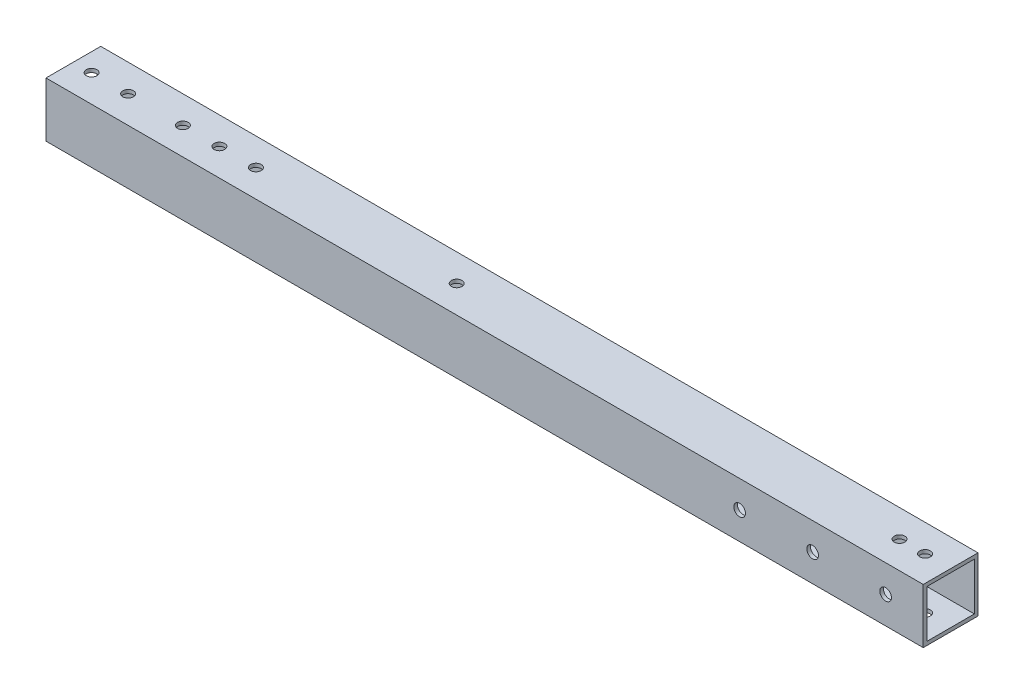
ISO-10303-21;
HEADER;
FILE_DESCRIPTION(('STEP AP214'),'2;1');
FILE_NAME('part.step','',(''),(''),'','','');
FILE_SCHEMA(('AUTOMOTIVE_DESIGN { 1 0 10303 214 1 1 1 1 }'));
ENDSEC;
DATA;
#1=APPLICATION_CONTEXT('core data for automotive mechanical design processes');
#2=APPLICATION_PROTOCOL_DEFINITION('international standard','automotive_design',2000,#1);
#3=PRODUCT_CONTEXT('',#1,'mechanical');
#4=PRODUCT('Part','Part','',(#3));
#5=PRODUCT_RELATED_PRODUCT_CATEGORY('part','',(#4));
#6=PRODUCT_DEFINITION_FORMATION('','',#4);
#7=PRODUCT_DEFINITION_CONTEXT('part definition',#1,'design');
#8=PRODUCT_DEFINITION('design','',#6,#7);
#9=PRODUCT_DEFINITION_SHAPE('','',#8);
#10=(LENGTH_UNIT() NAMED_UNIT(*) SI_UNIT(.MILLI.,.METRE.));
#11=(NAMED_UNIT(*) PLANE_ANGLE_UNIT() SI_UNIT($,.RADIAN.));
#12=(NAMED_UNIT(*) SI_UNIT($,.STERADIAN.) SOLID_ANGLE_UNIT());
#13=UNCERTAINTY_MEASURE_WITH_UNIT(LENGTH_MEASURE(1.E-05),#10,'distance_accuracy_value','');
#14=(GEOMETRIC_REPRESENTATION_CONTEXT(3) GLOBAL_UNCERTAINTY_ASSIGNED_CONTEXT((#13)) GLOBAL_UNIT_ASSIGNED_CONTEXT((#10,
#11,#12)) REPRESENTATION_CONTEXT('',''));
#15=CARTESIAN_POINT('',(0.,0.,0.));
#16=DIRECTION('',(0.,0.,1.));
#17=DIRECTION('',(1.,0.,0.));
#18=AXIS2_PLACEMENT_3D('',#15,#16,#17);
#19=CARTESIAN_POINT('',(240.3,0.,0.));
#20=DIRECTION('',(-1.,0.,0.));
#21=DIRECTION('',(0.,0.,1.));
#22=AXIS2_PLACEMENT_3D('',#19,#20,#21);
#23=PLANE('',#22);
#24=DIRECTION('',(0.,1.,0.));
#25=VECTOR('',#24,1.);
#26=CARTESIAN_POINT('',(240.3,-7.5,-7.5));
#27=LINE('',#26,#25);
#28=CARTESIAN_POINT('',(240.3,-7.5,-7.5));
#29=VERTEX_POINT('',#28);
#30=CARTESIAN_POINT('',(240.3,7.5,-7.5));
#31=VERTEX_POINT('',#30);
#32=EDGE_CURVE('E164',#29,#31,#27,.T.);
#33=ORIENTED_EDGE('',*,*,#32,.T.);
#34=DIRECTION('',(0.,0.,1.));
#35=VECTOR('',#34,1.);
#36=CARTESIAN_POINT('',(240.3,7.5,7.5));
#37=LINE('',#36,#35);
#38=CARTESIAN_POINT('',(240.3,7.5,7.5));
#39=VERTEX_POINT('',#38);
#40=EDGE_CURVE('E168',#31,#39,#37,.T.);
#41=ORIENTED_EDGE('',*,*,#40,.T.);
#42=DIRECTION('',(0.,-1.,0.));
#43=VECTOR('',#42,1.);
#44=CARTESIAN_POINT('',(240.3,-7.5,7.5));
#45=LINE('',#44,#43);
#46=CARTESIAN_POINT('',(240.3,-7.5,7.5));
#47=VERTEX_POINT('',#46);
#48=EDGE_CURVE('E172',#39,#47,#45,.T.);
#49=ORIENTED_EDGE('',*,*,#48,.T.);
#50=DIRECTION('',(0.,0.,-1.));
#51=VECTOR('',#50,1.);
#52=CARTESIAN_POINT('',(240.3,-7.5,7.5));
#53=LINE('',#52,#51);
#54=EDGE_CURVE('E175',#47,#29,#53,.T.);
#55=ORIENTED_EDGE('',*,*,#54,.T.);
#56=EDGE_LOOP('',(#33,#41,#49,#55));
#57=FACE_BOUND('',#56,.T.);
#58=DIRECTION('',(0.,0.,-1.));
#59=VECTOR('',#58,1.);
#60=CARTESIAN_POINT('',(240.3,-6.5,6.5));
#61=LINE('',#60,#59);
#62=CARTESIAN_POINT('',(240.3,-6.5,6.5));
#63=VERTEX_POINT('',#62);
#64=CARTESIAN_POINT('',(240.3,-6.5,-6.5));
#65=VERTEX_POINT('',#64);
#66=EDGE_CURVE('E112',#63,#65,#61,.T.);
#67=ORIENTED_EDGE('',*,*,#66,.F.);
#68=DIRECTION('',(0.,-1.,0.));
#69=VECTOR('',#68,1.);
#70=CARTESIAN_POINT('',(240.3,-6.5,6.5));
#71=LINE('',#70,#69);
#72=CARTESIAN_POINT('',(240.3,6.5,6.5));
#73=VERTEX_POINT('',#72);
#74=EDGE_CURVE('E140',#73,#63,#71,.T.);
#75=ORIENTED_EDGE('',*,*,#74,.F.);
#76=DIRECTION('',(0.,0.,1.));
#77=VECTOR('',#76,1.);
#78=CARTESIAN_POINT('',(240.3,6.5,6.5));
#79=LINE('',#78,#77);
#80=CARTESIAN_POINT('',(240.3,6.5,-6.5));
#81=VERTEX_POINT('',#80);
#82=EDGE_CURVE('E134',#81,#73,#79,.T.);
#83=ORIENTED_EDGE('',*,*,#82,.F.);
#84=DIRECTION('',(0.,1.,0.));
#85=VECTOR('',#84,1.);
#86=CARTESIAN_POINT('',(240.3,-6.5,-6.5));
#87=LINE('',#86,#85);
#88=EDGE_CURVE('E121',#65,#81,#87,.T.);
#89=ORIENTED_EDGE('',*,*,#88,.F.);
#90=EDGE_LOOP('',(#67,#75,#83,#89));
#91=FACE_BOUND('',#90,.T.);
#92=ADVANCED_FACE('F44',(#57,#91),#23,.F.);
#93=CARTESIAN_POINT('',(0.,0.,0.));
#94=DIRECTION('',(-1.,0.,0.));
#95=DIRECTION('',(0.,0.,1.));
#96=AXIS2_PLACEMENT_3D('',#93,#94,#95);
#97=PLANE('',#96);
#98=DIRECTION('',(0.,1.,0.));
#99=VECTOR('',#98,1.);
#100=CARTESIAN_POINT('',(0.,-7.5,-7.5));
#101=LINE('',#100,#99);
#102=CARTESIAN_POINT('',(0.,-7.5,-7.5));
#103=VERTEX_POINT('',#102);
#104=CARTESIAN_POINT('',(0.,7.5,-7.5));
#105=VERTEX_POINT('',#104);
#106=EDGE_CURVE('E130',#103,#105,#101,.T.);
#107=ORIENTED_EDGE('',*,*,#106,.F.);
#108=DIRECTION('',(0.,0.,-1.));
#109=VECTOR('',#108,1.);
#110=CARTESIAN_POINT('',(0.,-7.5,7.5));
#111=LINE('',#110,#109);
#112=CARTESIAN_POINT('',(0.,-7.5,7.5));
#113=VERTEX_POINT('',#112);
#114=EDGE_CURVE('E169',#113,#103,#111,.T.);
#115=ORIENTED_EDGE('',*,*,#114,.F.);
#116=DIRECTION('',(0.,-1.,0.));
#117=VECTOR('',#116,1.);
#118=CARTESIAN_POINT('',(0.,-7.5,7.5));
#119=LINE('',#118,#117);
#120=CARTESIAN_POINT('',(0.,7.5,7.5));
#121=VERTEX_POINT('',#120);
#122=EDGE_CURVE('E185',#121,#113,#119,.T.);
#123=ORIENTED_EDGE('',*,*,#122,.F.);
#124=DIRECTION('',(0.,0.,1.));
#125=VECTOR('',#124,1.);
#126=CARTESIAN_POINT('',(0.,7.5,7.5));
#127=LINE('',#126,#125);
#128=EDGE_CURVE('E182',#105,#121,#127,.T.);
#129=ORIENTED_EDGE('',*,*,#128,.F.);
#130=EDGE_LOOP('',(#107,#115,#123,#129));
#131=FACE_BOUND('',#130,.T.);
#132=DIRECTION('',(0.,-1.,0.));
#133=VECTOR('',#132,1.);
#134=CARTESIAN_POINT('',(0.,-6.5,6.5));
#135=LINE('',#134,#133);
#136=CARTESIAN_POINT('',(0.,6.5,6.5));
#137=VERTEX_POINT('',#136);
#138=CARTESIAN_POINT('',(0.,-6.5,6.5));
#139=VERTEX_POINT('',#138);
#140=EDGE_CURVE('E122',#137,#139,#135,.T.);
#141=ORIENTED_EDGE('',*,*,#140,.T.);
#142=DIRECTION('',(0.,0.,-1.));
#143=VECTOR('',#142,1.);
#144=CARTESIAN_POINT('',(0.,-6.5,6.5));
#145=LINE('',#144,#143);
#146=CARTESIAN_POINT('',(0.,-6.5,-6.5));
#147=VERTEX_POINT('',#146);
#148=EDGE_CURVE('E70',#139,#147,#145,.T.);
#149=ORIENTED_EDGE('',*,*,#148,.T.);
#150=DIRECTION('',(0.,1.,0.));
#151=VECTOR('',#150,1.);
#152=CARTESIAN_POINT('',(0.,-6.5,-6.5));
#153=LINE('',#152,#151);
#154=CARTESIAN_POINT('',(0.,6.5,-6.5));
#155=VERTEX_POINT('',#154);
#156=EDGE_CURVE('E128',#147,#155,#153,.T.);
#157=ORIENTED_EDGE('',*,*,#156,.T.);
#158=DIRECTION('',(0.,0.,1.));
#159=VECTOR('',#158,1.);
#160=CARTESIAN_POINT('',(0.,6.5,6.5));
#161=LINE('',#160,#159);
#162=EDGE_CURVE('E151',#155,#137,#161,.T.);
#163=ORIENTED_EDGE('',*,*,#162,.T.);
#164=EDGE_LOOP('',(#141,#149,#157,#163));
#165=FACE_BOUND('',#164,.T.);
#166=ADVANCED_FACE('F398',(#131,#165),#97,.T.);
#167=CARTESIAN_POINT('',(240.3,-7.5,-7.5));
#168=DIRECTION('',(0.,0.,1.));
#169=DIRECTION('',(1.,0.,0.));
#170=AXIS2_PLACEMENT_3D('',#167,#168,#169);
#171=PLANE('',#170);
#172=CARTESIAN_POINT('',(229.998484809867,2.61686872083814E-13,-7.5));
#173=DIRECTION('',(0.,0.,1.));
#174=DIRECTION('',(1.,0.,0.));
#175=AXIS2_PLACEMENT_3D('',#172,#173,#174);
#176=CIRCLE('',#175,1.59999999999999);
#177=CARTESIAN_POINT('',(231.598484809867,2.61686872083814E-13,-7.5));
#178=VERTEX_POINT('',#177);
#179=EDGE_CURVE('E242',#178,#178,#176,.T.);
#180=ORIENTED_EDGE('',*,*,#179,.T.);
#181=EDGE_LOOP('',(#180));
#182=FACE_BOUND('',#181,.T.);
#183=CARTESIAN_POINT('',(189.998484809867,2.78340217453191E-13,-7.5));
#184=DIRECTION('',(0.,0.,1.));
#185=DIRECTION('',(1.,0.,0.));
#186=AXIS2_PLACEMENT_3D('',#183,#184,#185);
#187=CIRCLE('',#186,1.59999999999999);
#188=CARTESIAN_POINT('',(191.598484809867,2.78340217453191E-13,-7.5));
#189=VERTEX_POINT('',#188);
#190=EDGE_CURVE('E502',#189,#189,#187,.T.);
#191=ORIENTED_EDGE('',*,*,#190,.T.);
#192=EDGE_LOOP('',(#191));
#193=FACE_BOUND('',#192,.T.);
#194=CARTESIAN_POINT('',(209.998484809867,2.71748268244479E-13,-7.5));
#195=DIRECTION('',(0.,0.,1.));
#196=DIRECTION('',(1.,0.,0.));
#197=AXIS2_PLACEMENT_3D('',#194,#195,#196);
#198=CIRCLE('',#197,1.59999999999999);
#199=CARTESIAN_POINT('',(211.598484809867,2.71748268244479E-13,-7.5));
#200=VERTEX_POINT('',#199);
#201=EDGE_CURVE('E261',#200,#200,#198,.T.);
#202=ORIENTED_EDGE('',*,*,#201,.T.);
#203=EDGE_LOOP('',(#202));
#204=FACE_BOUND('',#203,.T.);
#205=ORIENTED_EDGE('',*,*,#106,.T.);
#206=DIRECTION('',(-1.,0.,0.));
#207=VECTOR('',#206,1.);
#208=CARTESIAN_POINT('',(240.3,7.5,-7.5));
#209=LINE('',#208,#207);
#210=EDGE_CURVE('E11',#31,#105,#209,.T.);
#211=ORIENTED_EDGE('',*,*,#210,.F.);
#212=ORIENTED_EDGE('',*,*,#32,.F.);
#213=DIRECTION('',(-1.,0.,0.));
#214=VECTOR('',#213,1.);
#215=CARTESIAN_POINT('',(240.3,-7.5,-7.5));
#216=LINE('',#215,#214);
#217=EDGE_CURVE('E178',#29,#103,#216,.T.);
#218=ORIENTED_EDGE('',*,*,#217,.T.);
#219=EDGE_LOOP('',(#205,#211,#212,#218));
#220=FACE_BOUND('',#219,.T.);
#221=ADVANCED_FACE('F46',(#182,#193,#204,#220),#171,.F.);
#222=CARTESIAN_POINT('',(240.3,7.5,7.5));
#223=DIRECTION('',(0.,-1.,0.));
#224=DIRECTION('',(0.,0.,-1.));
#225=AXIS2_PLACEMENT_3D('',#222,#223,#224);
#226=PLANE('',#225);
#227=CARTESIAN_POINT('',(233.3,7.5,0.));
#228=DIRECTION('',(0.,1.,0.));
#229=DIRECTION('',(0.,0.,1.));
#230=AXIS2_PLACEMENT_3D('',#227,#228,#229);
#231=CIRCLE('',#230,1.45);
#232=CARTESIAN_POINT('',(233.3,7.5,1.45));
#233=VERTEX_POINT('',#232);
#234=EDGE_CURVE('E272',#233,#233,#231,.T.);
#235=ORIENTED_EDGE('',*,*,#234,.F.);
#236=EDGE_LOOP('',(#235));
#237=FACE_BOUND('',#236,.T.);
#238=CARTESIAN_POINT('',(104.998484809868,7.5,0.));
#239=DIRECTION('',(0.,1.,0.));
#240=DIRECTION('',(0.,0.,1.));
#241=AXIS2_PLACEMENT_3D('',#238,#239,#240);
#242=CIRCLE('',#241,1.45);
#243=CARTESIAN_POINT('',(104.998484809868,7.5,1.45));
#244=VERTEX_POINT('',#243);
#245=EDGE_CURVE('E294',#244,#244,#242,.T.);
#246=ORIENTED_EDGE('',*,*,#245,.F.);
#247=EDGE_LOOP('',(#246));
#248=FACE_BOUND('',#247,.T.);
#249=CARTESIAN_POINT('',(49.9984848098679,7.5,0.));
#250=DIRECTION('',(0.,1.,0.));
#251=DIRECTION('',(0.,0.,1.));
#252=AXIS2_PLACEMENT_3D('',#249,#250,#251);
#253=CIRCLE('',#252,1.45);
#254=CARTESIAN_POINT('',(49.9984848098679,7.5,1.45));
#255=VERTEX_POINT('',#254);
#256=EDGE_CURVE('E286',#255,#255,#253,.T.);
#257=ORIENTED_EDGE('',*,*,#256,.F.);
#258=EDGE_LOOP('',(#257));
#259=FACE_BOUND('',#258,.T.);
#260=CARTESIAN_POINT('',(39.9984848098679,7.5,0.));
#261=DIRECTION('',(0.,1.,0.));
#262=DIRECTION('',(0.,0.,1.));
#263=AXIS2_PLACEMENT_3D('',#260,#261,#262);
#264=CIRCLE('',#263,1.45);
#265=CARTESIAN_POINT('',(39.9984848098679,7.5,1.45));
#266=VERTEX_POINT('',#265);
#267=EDGE_CURVE('E277',#266,#266,#264,.T.);
#268=ORIENTED_EDGE('',*,*,#267,.F.);
#269=EDGE_LOOP('',(#268));
#270=FACE_BOUND('',#269,.T.);
#271=CARTESIAN_POINT('',(226.3,7.5,0.));
#272=DIRECTION('',(0.,1.,0.));
#273=DIRECTION('',(0.,0.,1.));
#274=AXIS2_PLACEMENT_3D('',#271,#272,#273);
#275=CIRCLE('',#274,1.45);
#276=CARTESIAN_POINT('',(226.3,7.5,1.45));
#277=VERTEX_POINT('',#276);
#278=EDGE_CURVE('E276',#277,#277,#275,.T.);
#279=ORIENTED_EDGE('',*,*,#278,.F.);
#280=EDGE_LOOP('',(#279));
#281=FACE_BOUND('',#280,.T.);
#282=CARTESIAN_POINT('',(14.9984848098679,7.5,3.02162921075933E-13));
#283=DIRECTION('',(0.,1.,0.));
#284=DIRECTION('',(0.,0.,1.));
#285=AXIS2_PLACEMENT_3D('',#282,#283,#284);
#286=CIRCLE('',#285,1.45);
#287=CARTESIAN_POINT('',(14.9984848098679,7.5,1.4500000000003));
#288=VERTEX_POINT('',#287);
#289=EDGE_CURVE('E322',#288,#288,#286,.T.);
#290=ORIENTED_EDGE('',*,*,#289,.F.);
#291=EDGE_LOOP('',(#290));
#292=FACE_BOUND('',#291,.T.);
#293=CARTESIAN_POINT('',(4.99848480986785,7.5,2.98811103362712E-13));
#294=DIRECTION('',(0.,1.,0.));
#295=DIRECTION('',(0.,0.,1.));
#296=AXIS2_PLACEMENT_3D('',#293,#294,#295);
#297=CIRCLE('',#296,1.45);
#298=CARTESIAN_POINT('',(4.99848480986785,7.5,1.4500000000003));
#299=VERTEX_POINT('',#298);
#300=EDGE_CURVE('E300',#299,#299,#297,.T.);
#301=ORIENTED_EDGE('',*,*,#300,.F.);
#302=EDGE_LOOP('',(#301));
#303=FACE_BOUND('',#302,.T.);
#304=CARTESIAN_POINT('',(29.9984848098679,7.5,0.));
#305=DIRECTION('',(0.,1.,0.));
#306=DIRECTION('',(0.,0.,1.));
#307=AXIS2_PLACEMENT_3D('',#304,#305,#306);
#308=CIRCLE('',#307,1.45);
#309=CARTESIAN_POINT('',(29.9984848098679,7.5,1.45));
#310=VERTEX_POINT('',#309);
#311=EDGE_CURVE('E309',#310,#310,#308,.T.);
#312=ORIENTED_EDGE('',*,*,#311,.F.);
#313=EDGE_LOOP('',(#312));
#314=FACE_BOUND('',#313,.T.);
#315=ORIENTED_EDGE('',*,*,#128,.T.);
#316=DIRECTION('',(-1.,0.,0.));
#317=VECTOR('',#316,1.);
#318=CARTESIAN_POINT('',(240.3,7.5,7.5));
#319=LINE('',#318,#317);
#320=EDGE_CURVE('E54',#39,#121,#319,.T.);
#321=ORIENTED_EDGE('',*,*,#320,.F.);
#322=ORIENTED_EDGE('',*,*,#40,.F.);
#323=ORIENTED_EDGE('',*,*,#210,.T.);
#324=EDGE_LOOP('',(#315,#321,#322,#323));
#325=FACE_BOUND('',#324,.T.);
#326=ADVANCED_FACE('F402',(#237,#248,#259,#270,#281,#292,#303,#314,#325),#226,.F.);
#327=CARTESIAN_POINT('',(240.3,-7.5,7.5));
#328=DIRECTION('',(0.,0.,-1.));
#329=DIRECTION('',(-1.,0.,0.));
#330=AXIS2_PLACEMENT_3D('',#327,#328,#329);
#331=PLANE('',#330);
#332=CARTESIAN_POINT('',(229.998484809867,2.61686872083814E-13,7.5));
#333=DIRECTION('',(0.,0.,1.));
#334=DIRECTION('',(1.,0.,0.));
#335=AXIS2_PLACEMENT_3D('',#332,#333,#334);
#336=CIRCLE('',#335,1.59999999999999);
#337=CARTESIAN_POINT('',(231.598484809867,2.61686872083814E-13,7.5));
#338=VERTEX_POINT('',#337);
#339=EDGE_CURVE('E493',#338,#338,#336,.T.);
#340=ORIENTED_EDGE('',*,*,#339,.F.);
#341=EDGE_LOOP('',(#340));
#342=FACE_BOUND('',#341,.T.);
#343=CARTESIAN_POINT('',(189.998484809867,2.78340217453191E-13,7.5));
#344=DIRECTION('',(0.,0.,1.));
#345=DIRECTION('',(1.,0.,0.));
#346=AXIS2_PLACEMENT_3D('',#343,#344,#345);
#347=CIRCLE('',#346,1.59999999999999);
#348=CARTESIAN_POINT('',(191.598484809867,2.78340217453191E-13,7.5));
#349=VERTEX_POINT('',#348);
#350=EDGE_CURVE('E497',#349,#349,#347,.T.);
#351=ORIENTED_EDGE('',*,*,#350,.F.);
#352=EDGE_LOOP('',(#351));
#353=FACE_BOUND('',#352,.T.);
#354=CARTESIAN_POINT('',(209.998484809867,2.71748268244479E-13,7.5));
#355=DIRECTION('',(0.,0.,1.));
#356=DIRECTION('',(1.,0.,0.));
#357=AXIS2_PLACEMENT_3D('',#354,#355,#356);
#358=CIRCLE('',#357,1.59999999999999);
#359=CARTESIAN_POINT('',(211.598484809867,2.71748268244479E-13,7.5));
#360=VERTEX_POINT('',#359);
#361=EDGE_CURVE('E505',#360,#360,#358,.T.);
#362=ORIENTED_EDGE('',*,*,#361,.F.);
#363=EDGE_LOOP('',(#362));
#364=FACE_BOUND('',#363,.T.);
#365=ORIENTED_EDGE('',*,*,#122,.T.);
#366=DIRECTION('',(-1.,0.,0.));
#367=VECTOR('',#366,1.);
#368=CARTESIAN_POINT('',(240.3,-7.5,7.5));
#369=LINE('',#368,#367);
#370=EDGE_CURVE('E192',#47,#113,#369,.T.);
#371=ORIENTED_EDGE('',*,*,#370,.F.);
#372=ORIENTED_EDGE('',*,*,#48,.F.);
#373=ORIENTED_EDGE('',*,*,#320,.T.);
#374=EDGE_LOOP('',(#365,#371,#372,#373));
#375=FACE_BOUND('',#374,.T.);
#376=ADVANCED_FACE('F385',(#342,#353,#364,#375),#331,.F.);
#377=CARTESIAN_POINT('',(240.3,-7.5,7.5));
#378=DIRECTION('',(0.,1.,0.));
#379=DIRECTION('',(0.,0.,1.));
#380=AXIS2_PLACEMENT_3D('',#377,#378,#379);
#381=PLANE('',#380);
#382=CARTESIAN_POINT('',(233.3,-7.5,0.));
#383=DIRECTION('',(0.,1.,0.));
#384=DIRECTION('',(0.,0.,1.));
#385=AXIS2_PLACEMENT_3D('',#382,#383,#384);
#386=CIRCLE('',#385,1.45);
#387=CARTESIAN_POINT('',(233.3,-7.5,1.45));
#388=VERTEX_POINT('',#387);
#389=EDGE_CURVE('E204',#388,#388,#386,.T.);
#390=ORIENTED_EDGE('',*,*,#389,.T.);
#391=EDGE_LOOP('',(#390));
#392=FACE_BOUND('',#391,.T.);
#393=CARTESIAN_POINT('',(104.998484809868,-7.5,0.));
#394=DIRECTION('',(0.,1.,0.));
#395=DIRECTION('',(0.,0.,1.));
#396=AXIS2_PLACEMENT_3D('',#393,#394,#395);
#397=CIRCLE('',#396,1.45);
#398=CARTESIAN_POINT('',(104.998484809868,-7.5,1.45));
#399=VERTEX_POINT('',#398);
#400=EDGE_CURVE('E268',#399,#399,#397,.T.);
#401=ORIENTED_EDGE('',*,*,#400,.T.);
#402=EDGE_LOOP('',(#401));
#403=FACE_BOUND('',#402,.T.);
#404=CARTESIAN_POINT('',(49.9984848098679,-7.5,0.));
#405=DIRECTION('',(0.,1.,0.));
#406=DIRECTION('',(0.,0.,1.));
#407=AXIS2_PLACEMENT_3D('',#404,#405,#406);
#408=CIRCLE('',#407,1.45);
#409=CARTESIAN_POINT('',(49.9984848098679,-7.5,1.45));
#410=VERTEX_POINT('',#409);
#411=EDGE_CURVE('E290',#410,#410,#408,.T.);
#412=ORIENTED_EDGE('',*,*,#411,.T.);
#413=EDGE_LOOP('',(#412));
#414=FACE_BOUND('',#413,.T.);
#415=CARTESIAN_POINT('',(39.9984848098679,-7.5,0.));
#416=DIRECTION('',(0.,1.,0.));
#417=DIRECTION('',(0.,0.,1.));
#418=AXIS2_PLACEMENT_3D('',#415,#416,#417);
#419=CIRCLE('',#418,1.45);
#420=CARTESIAN_POINT('',(39.9984848098679,-7.5,1.45));
#421=VERTEX_POINT('',#420);
#422=EDGE_CURVE('E282',#421,#421,#419,.T.);
#423=ORIENTED_EDGE('',*,*,#422,.T.);
#424=EDGE_LOOP('',(#423));
#425=FACE_BOUND('',#424,.T.);
#426=CARTESIAN_POINT('',(226.3,-7.5,0.));
#427=DIRECTION('',(0.,1.,0.));
#428=DIRECTION('',(0.,0.,1.));
#429=AXIS2_PLACEMENT_3D('',#426,#427,#428);
#430=CIRCLE('',#429,1.45);
#431=CARTESIAN_POINT('',(226.3,-7.5,1.45));
#432=VERTEX_POINT('',#431);
#433=EDGE_CURVE('E318',#432,#432,#430,.T.);
#434=ORIENTED_EDGE('',*,*,#433,.T.);
#435=EDGE_LOOP('',(#434));
#436=FACE_BOUND('',#435,.T.);
#437=CARTESIAN_POINT('',(14.9984848098679,-7.5,3.02162921075933E-13));
#438=DIRECTION('',(0.,1.,0.));
#439=DIRECTION('',(0.,0.,1.));
#440=AXIS2_PLACEMENT_3D('',#437,#438,#439);
#441=CIRCLE('',#440,1.45);
#442=CARTESIAN_POINT('',(14.9984848098679,-7.5,1.4500000000003));
#443=VERTEX_POINT('',#442);
#444=EDGE_CURVE('E304',#443,#443,#441,.T.);
#445=ORIENTED_EDGE('',*,*,#444,.T.);
#446=EDGE_LOOP('',(#445));
#447=FACE_BOUND('',#446,.T.);
#448=CARTESIAN_POINT('',(4.99848480986785,-7.5,2.98811103362712E-13));
#449=DIRECTION('',(0.,1.,0.));
#450=DIRECTION('',(0.,0.,1.));
#451=AXIS2_PLACEMENT_3D('',#448,#449,#450);
#452=CIRCLE('',#451,1.45);
#453=CARTESIAN_POINT('',(4.99848480986785,-7.5,1.4500000000003));
#454=VERTEX_POINT('',#453);
#455=EDGE_CURVE('E305',#454,#454,#452,.T.);
#456=ORIENTED_EDGE('',*,*,#455,.T.);
#457=EDGE_LOOP('',(#456));
#458=FACE_BOUND('',#457,.T.);
#459=CARTESIAN_POINT('',(29.9984848098679,-7.5,0.));
#460=DIRECTION('',(0.,1.,0.));
#461=DIRECTION('',(0.,0.,1.));
#462=AXIS2_PLACEMENT_3D('',#459,#460,#461);
#463=CIRCLE('',#462,1.45);
#464=CARTESIAN_POINT('',(29.9984848098679,-7.5,1.45));
#465=VERTEX_POINT('',#464);
#466=EDGE_CURVE('E281',#465,#465,#463,.T.);
#467=ORIENTED_EDGE('',*,*,#466,.T.);
#468=EDGE_LOOP('',(#467));
#469=FACE_BOUND('',#468,.T.);
#470=ORIENTED_EDGE('',*,*,#114,.T.);
#471=ORIENTED_EDGE('',*,*,#217,.F.);
#472=ORIENTED_EDGE('',*,*,#54,.F.);
#473=ORIENTED_EDGE('',*,*,#370,.T.);
#474=EDGE_LOOP('',(#470,#471,#472,#473));
#475=FACE_BOUND('',#474,.T.);
#476=ADVANCED_FACE('F358',(#392,#403,#414,#425,#436,#447,#458,#469,#475),#381,.F.);
#477=CARTESIAN_POINT('',(240.3,-6.5,6.5));
#478=DIRECTION('',(0.,1.,0.));
#479=DIRECTION('',(0.,0.,1.));
#480=AXIS2_PLACEMENT_3D('',#477,#478,#479);
#481=PLANE('',#480);
#482=CARTESIAN_POINT('',(233.3,-6.5,0.));
#483=DIRECTION('',(0.,1.,0.));
#484=DIRECTION('',(0.,0.,1.));
#485=AXIS2_PLACEMENT_3D('',#482,#483,#484);
#486=CIRCLE('',#485,1.45);
#487=CARTESIAN_POINT('',(233.3,-6.5,1.45));
#488=VERTEX_POINT('',#487);
#489=EDGE_CURVE('E148',#488,#488,#486,.T.);
#490=ORIENTED_EDGE('',*,*,#489,.F.);
#491=EDGE_LOOP('',(#490));
#492=FACE_BOUND('',#491,.T.);
#493=CARTESIAN_POINT('',(104.998484809868,-6.5,0.));
#494=DIRECTION('',(0.,1.,0.));
#495=DIRECTION('',(0.,0.,1.));
#496=AXIS2_PLACEMENT_3D('',#493,#494,#495);
#497=CIRCLE('',#496,1.45);
#498=CARTESIAN_POINT('',(104.998484809868,-6.5,1.45));
#499=VERTEX_POINT('',#498);
#500=EDGE_CURVE('E234',#499,#499,#497,.T.);
#501=ORIENTED_EDGE('',*,*,#500,.F.);
#502=EDGE_LOOP('',(#501));
#503=FACE_BOUND('',#502,.T.);
#504=CARTESIAN_POINT('',(49.9984848098679,-6.5,0.));
#505=DIRECTION('',(0.,1.,0.));
#506=DIRECTION('',(0.,0.,1.));
#507=AXIS2_PLACEMENT_3D('',#504,#505,#506);
#508=CIRCLE('',#507,1.45);
#509=CARTESIAN_POINT('',(49.9984848098679,-6.5,1.45));
#510=VERTEX_POINT('',#509);
#511=EDGE_CURVE('E229',#510,#510,#508,.T.);
#512=ORIENTED_EDGE('',*,*,#511,.F.);
#513=EDGE_LOOP('',(#512));
#514=FACE_BOUND('',#513,.T.);
#515=CARTESIAN_POINT('',(39.9984848098679,-6.5,0.));
#516=DIRECTION('',(0.,1.,0.));
#517=DIRECTION('',(0.,0.,1.));
#518=AXIS2_PLACEMENT_3D('',#515,#516,#517);
#519=CIRCLE('',#518,1.45);
#520=CARTESIAN_POINT('',(39.9984848098679,-6.5,1.45));
#521=VERTEX_POINT('',#520);
#522=EDGE_CURVE('E224',#521,#521,#519,.T.);
#523=ORIENTED_EDGE('',*,*,#522,.F.);
#524=EDGE_LOOP('',(#523));
#525=FACE_BOUND('',#524,.T.);
#526=CARTESIAN_POINT('',(226.3,-6.5,0.));
#527=DIRECTION('',(0.,1.,0.));
#528=DIRECTION('',(0.,0.,1.));
#529=AXIS2_PLACEMENT_3D('',#526,#527,#528);
#530=CIRCLE('',#529,1.45);
#531=CARTESIAN_POINT('',(226.3,-6.5,1.45));
#532=VERTEX_POINT('',#531);
#533=EDGE_CURVE('E219',#532,#532,#530,.T.);
#534=ORIENTED_EDGE('',*,*,#533,.F.);
#535=EDGE_LOOP('',(#534));
#536=FACE_BOUND('',#535,.T.);
#537=CARTESIAN_POINT('',(14.9984848098679,-6.5,3.02162921075933E-13));
#538=DIRECTION('',(0.,1.,0.));
#539=DIRECTION('',(0.,0.,1.));
#540=AXIS2_PLACEMENT_3D('',#537,#538,#539);
#541=CIRCLE('',#540,1.45);
#542=CARTESIAN_POINT('',(14.9984848098679,-6.5,1.4500000000003));
#543=VERTEX_POINT('',#542);
#544=EDGE_CURVE('E214',#543,#543,#541,.T.);
#545=ORIENTED_EDGE('',*,*,#544,.F.);
#546=EDGE_LOOP('',(#545));
#547=FACE_BOUND('',#546,.T.);
#548=CARTESIAN_POINT('',(4.99848480986785,-6.5,2.98811103362712E-13));
#549=DIRECTION('',(0.,1.,0.));
#550=DIRECTION('',(0.,0.,1.));
#551=AXIS2_PLACEMENT_3D('',#548,#549,#550);
#552=CIRCLE('',#551,1.45);
#553=CARTESIAN_POINT('',(4.99848480986785,-6.5,1.4500000000003));
#554=VERTEX_POINT('',#553);
#555=EDGE_CURVE('E209',#554,#554,#552,.T.);
#556=ORIENTED_EDGE('',*,*,#555,.F.);
#557=EDGE_LOOP('',(#556));
#558=FACE_BOUND('',#557,.T.);
#559=CARTESIAN_POINT('',(29.9984848098679,-6.5,0.));
#560=DIRECTION('',(0.,1.,0.));
#561=DIRECTION('',(0.,0.,1.));
#562=AXIS2_PLACEMENT_3D('',#559,#560,#561);
#563=CIRCLE('',#562,1.45);
#564=CARTESIAN_POINT('',(29.9984848098679,-6.5,1.45));
#565=VERTEX_POINT('',#564);
#566=EDGE_CURVE('E203',#565,#565,#563,.T.);
#567=ORIENTED_EDGE('',*,*,#566,.F.);
#568=EDGE_LOOP('',(#567));
#569=FACE_BOUND('',#568,.T.);
#570=ORIENTED_EDGE('',*,*,#148,.F.);
#571=DIRECTION('',(-1.,0.,0.));
#572=VECTOR('',#571,1.);
#573=CARTESIAN_POINT('',(240.3,-6.5,6.5));
#574=LINE('',#573,#572);
#575=EDGE_CURVE('E116',#63,#139,#574,.T.);
#576=ORIENTED_EDGE('',*,*,#575,.F.);
#577=ORIENTED_EDGE('',*,*,#66,.T.);
#578=DIRECTION('',(-1.,0.,0.));
#579=VECTOR('',#578,1.);
#580=CARTESIAN_POINT('',(240.3,-6.5,-6.5));
#581=LINE('',#580,#579);
#582=EDGE_CURVE('E115',#65,#147,#581,.T.);
#583=ORIENTED_EDGE('',*,*,#582,.T.);
#584=EDGE_LOOP('',(#570,#576,#577,#583));
#585=FACE_BOUND('',#584,.T.);
#586=ADVANCED_FACE('F114',(#492,#503,#514,#525,#536,#547,#558,#569,#585),#481,.T.);
#587=CARTESIAN_POINT('',(240.3,-6.5,-6.5));
#588=DIRECTION('',(0.,0.,1.));
#589=DIRECTION('',(0.,-1.,0.));
#590=AXIS2_PLACEMENT_3D('',#587,#588,#589);
#591=PLANE('',#590);
#592=CARTESIAN_POINT('',(229.998484809867,2.61686872083814E-13,-6.5));
#593=DIRECTION('',(0.,0.,1.));
#594=DIRECTION('',(0.,-1.,0.));
#595=AXIS2_PLACEMENT_3D('',#592,#593,#594);
#596=CIRCLE('',#595,1.59999999999999);
#597=CARTESIAN_POINT('',(229.998484809867,-1.59999999999973,-6.5));
#598=VERTEX_POINT('',#597);
#599=EDGE_CURVE('E264',#598,#598,#596,.T.);
#600=ORIENTED_EDGE('',*,*,#599,.F.);
#601=EDGE_LOOP('',(#600));
#602=FACE_BOUND('',#601,.T.);
#603=CARTESIAN_POINT('',(189.998484809867,2.78340217453191E-13,-6.5));
#604=DIRECTION('',(0.,0.,1.));
#605=DIRECTION('',(0.,-1.,0.));
#606=AXIS2_PLACEMENT_3D('',#603,#604,#605);
#607=CIRCLE('',#606,1.59999999999999);
#608=CARTESIAN_POINT('',(189.998484809867,-1.59999999999971,-6.5));
#609=VERTEX_POINT('',#608);
#610=EDGE_CURVE('E246',#609,#609,#607,.T.);
#611=ORIENTED_EDGE('',*,*,#610,.F.);
#612=EDGE_LOOP('',(#611));
#613=FACE_BOUND('',#612,.T.);
#614=CARTESIAN_POINT('',(209.998484809867,2.71748268244479E-13,-6.5));
#615=DIRECTION('',(0.,0.,1.));
#616=DIRECTION('',(0.,-1.,0.));
#617=AXIS2_PLACEMENT_3D('',#614,#615,#616);
#618=CIRCLE('',#617,1.59999999999999);
#619=CARTESIAN_POINT('',(209.998484809867,-1.59999999999972,-6.5));
#620=VERTEX_POINT('',#619);
#621=EDGE_CURVE('E241',#620,#620,#618,.T.);
#622=ORIENTED_EDGE('',*,*,#621,.F.);
#623=EDGE_LOOP('',(#622));
#624=FACE_BOUND('',#623,.T.);
#625=ORIENTED_EDGE('',*,*,#156,.F.);
#626=ORIENTED_EDGE('',*,*,#582,.F.);
#627=ORIENTED_EDGE('',*,*,#88,.T.);
#628=DIRECTION('',(-1.,0.,0.));
#629=VECTOR('',#628,1.);
#630=CARTESIAN_POINT('',(240.3,6.5,-6.5));
#631=LINE('',#630,#629);
#632=EDGE_CURVE('E131',#81,#155,#631,.T.);
#633=ORIENTED_EDGE('',*,*,#632,.T.);
#634=EDGE_LOOP('',(#625,#626,#627,#633));
#635=FACE_BOUND('',#634,.T.);
#636=ADVANCED_FACE('F125',(#602,#613,#624,#635),#591,.T.);
#637=CARTESIAN_POINT('',(240.3,6.5,6.5));
#638=DIRECTION('',(0.,-1.,0.));
#639=DIRECTION('',(0.,0.,-1.));
#640=AXIS2_PLACEMENT_3D('',#637,#638,#639);
#641=PLANE('',#640);
#642=CARTESIAN_POINT('',(233.3,6.5,0.));
#643=DIRECTION('',(0.,-1.,0.));
#644=DIRECTION('',(0.,0.,-1.));
#645=AXIS2_PLACEMENT_3D('',#642,#643,#644);
#646=CIRCLE('',#645,1.45);
#647=CARTESIAN_POINT('',(233.3,6.5,-1.45));
#648=VERTEX_POINT('',#647);
#649=EDGE_CURVE('E235',#648,#648,#646,.T.);
#650=ORIENTED_EDGE('',*,*,#649,.F.);
#651=EDGE_LOOP('',(#650));
#652=FACE_BOUND('',#651,.T.);
#653=CARTESIAN_POINT('',(104.998484809868,6.5,0.));
#654=DIRECTION('',(0.,-1.,0.));
#655=DIRECTION('',(0.,0.,-1.));
#656=AXIS2_PLACEMENT_3D('',#653,#654,#655);
#657=CIRCLE('',#656,1.45);
#658=CARTESIAN_POINT('',(104.998484809868,6.5,-1.45));
#659=VERTEX_POINT('',#658);
#660=EDGE_CURVE('E230',#659,#659,#657,.T.);
#661=ORIENTED_EDGE('',*,*,#660,.F.);
#662=EDGE_LOOP('',(#661));
#663=FACE_BOUND('',#662,.T.);
#664=CARTESIAN_POINT('',(49.9984848098679,6.5,0.));
#665=DIRECTION('',(0.,-1.,0.));
#666=DIRECTION('',(0.,0.,-1.));
#667=AXIS2_PLACEMENT_3D('',#664,#665,#666);
#668=CIRCLE('',#667,1.45);
#669=CARTESIAN_POINT('',(49.9984848098679,6.5,-1.45));
#670=VERTEX_POINT('',#669);
#671=EDGE_CURVE('E225',#670,#670,#668,.T.);
#672=ORIENTED_EDGE('',*,*,#671,.F.);
#673=EDGE_LOOP('',(#672));
#674=FACE_BOUND('',#673,.T.);
#675=CARTESIAN_POINT('',(39.9984848098679,6.5,0.));
#676=DIRECTION('',(0.,-1.,0.));
#677=DIRECTION('',(0.,0.,-1.));
#678=AXIS2_PLACEMENT_3D('',#675,#676,#677);
#679=CIRCLE('',#678,1.45);
#680=CARTESIAN_POINT('',(39.9984848098679,6.5,-1.45));
#681=VERTEX_POINT('',#680);
#682=EDGE_CURVE('E220',#681,#681,#679,.T.);
#683=ORIENTED_EDGE('',*,*,#682,.F.);
#684=EDGE_LOOP('',(#683));
#685=FACE_BOUND('',#684,.T.);
#686=CARTESIAN_POINT('',(226.3,6.5,0.));
#687=DIRECTION('',(0.,-1.,0.));
#688=DIRECTION('',(0.,0.,-1.));
#689=AXIS2_PLACEMENT_3D('',#686,#687,#688);
#690=CIRCLE('',#689,1.45);
#691=CARTESIAN_POINT('',(226.3,6.5,-1.45));
#692=VERTEX_POINT('',#691);
#693=EDGE_CURVE('E215',#692,#692,#690,.T.);
#694=ORIENTED_EDGE('',*,*,#693,.F.);
#695=EDGE_LOOP('',(#694));
#696=FACE_BOUND('',#695,.T.);
#697=CARTESIAN_POINT('',(14.9984848098679,6.5,3.02162921075933E-13));
#698=DIRECTION('',(0.,-1.,0.));
#699=DIRECTION('',(0.,0.,-1.));
#700=AXIS2_PLACEMENT_3D('',#697,#698,#699);
#701=CIRCLE('',#700,1.45);
#702=CARTESIAN_POINT('',(14.9984848098679,6.5,-1.4499999999997));
#703=VERTEX_POINT('',#702);
#704=EDGE_CURVE('E210',#703,#703,#701,.T.);
#705=ORIENTED_EDGE('',*,*,#704,.F.);
#706=EDGE_LOOP('',(#705));
#707=FACE_BOUND('',#706,.T.);
#708=CARTESIAN_POINT('',(4.99848480986785,6.5,2.98811103362712E-13));
#709=DIRECTION('',(0.,-1.,0.));
#710=DIRECTION('',(0.,0.,-1.));
#711=AXIS2_PLACEMENT_3D('',#708,#709,#710);
#712=CIRCLE('',#711,1.45);
#713=CARTESIAN_POINT('',(4.99848480986785,6.5,-1.4499999999997));
#714=VERTEX_POINT('',#713);
#715=EDGE_CURVE('E205',#714,#714,#712,.T.);
#716=ORIENTED_EDGE('',*,*,#715,.F.);
#717=EDGE_LOOP('',(#716));
#718=FACE_BOUND('',#717,.T.);
#719=CARTESIAN_POINT('',(29.9984848098679,6.5,0.));
#720=DIRECTION('',(0.,-1.,0.));
#721=DIRECTION('',(0.,0.,-1.));
#722=AXIS2_PLACEMENT_3D('',#719,#720,#721);
#723=CIRCLE('',#722,1.45);
#724=CARTESIAN_POINT('',(29.9984848098679,6.5,-1.45));
#725=VERTEX_POINT('',#724);
#726=EDGE_CURVE('E199',#725,#725,#723,.T.);
#727=ORIENTED_EDGE('',*,*,#726,.F.);
#728=EDGE_LOOP('',(#727));
#729=FACE_BOUND('',#728,.T.);
#730=ORIENTED_EDGE('',*,*,#162,.F.);
#731=ORIENTED_EDGE('',*,*,#632,.F.);
#732=ORIENTED_EDGE('',*,*,#82,.T.);
#733=DIRECTION('',(-1.,0.,0.));
#734=VECTOR('',#733,1.);
#735=CARTESIAN_POINT('',(240.3,6.5,6.5));
#736=LINE('',#735,#734);
#737=EDGE_CURVE('E62',#73,#137,#736,.T.);
#738=ORIENTED_EDGE('',*,*,#737,.T.);
#739=EDGE_LOOP('',(#730,#731,#732,#738));
#740=FACE_BOUND('',#739,.T.);
#741=ADVANCED_FACE('F422',(#652,#663,#674,#685,#696,#707,#718,#729,#740),#641,.T.);
#742=CARTESIAN_POINT('',(240.3,-6.5,6.5));
#743=DIRECTION('',(0.,0.,-1.));
#744=DIRECTION('',(-1.,0.,0.));
#745=AXIS2_PLACEMENT_3D('',#742,#743,#744);
#746=PLANE('',#745);
#747=CARTESIAN_POINT('',(229.998484809867,2.61686872083814E-13,6.5));
#748=DIRECTION('',(0.,0.,-1.));
#749=DIRECTION('',(-1.,0.,0.));
#750=AXIS2_PLACEMENT_3D('',#747,#748,#749);
#751=CIRCLE('',#750,1.59999999999999);
#752=CARTESIAN_POINT('',(228.398484809867,2.61686872083814E-13,6.5));
#753=VERTEX_POINT('',#752);
#754=EDGE_CURVE('E48',#753,#753,#751,.T.);
#755=ORIENTED_EDGE('',*,*,#754,.F.);
#756=EDGE_LOOP('',(#755));
#757=FACE_BOUND('',#756,.T.);
#758=CARTESIAN_POINT('',(189.998484809867,2.78340217453191E-13,6.5));
#759=DIRECTION('',(0.,0.,-1.));
#760=DIRECTION('',(-1.,0.,0.));
#761=AXIS2_PLACEMENT_3D('',#758,#759,#760);
#762=CIRCLE('',#761,1.59999999999999);
#763=CARTESIAN_POINT('',(188.398484809867,2.78340217453191E-13,6.5));
#764=VERTEX_POINT('',#763);
#765=EDGE_CURVE('E243',#764,#764,#762,.T.);
#766=ORIENTED_EDGE('',*,*,#765,.F.);
#767=EDGE_LOOP('',(#766));
#768=FACE_BOUND('',#767,.T.);
#769=CARTESIAN_POINT('',(209.998484809867,2.71748268244479E-13,6.5));
#770=DIRECTION('',(0.,0.,-1.));
#771=DIRECTION('',(-1.,0.,0.));
#772=AXIS2_PLACEMENT_3D('',#769,#770,#771);
#773=CIRCLE('',#772,1.59999999999999);
#774=CARTESIAN_POINT('',(208.398484809867,2.71748268244479E-13,6.5));
#775=VERTEX_POINT('',#774);
#776=EDGE_CURVE('E238',#775,#775,#773,.T.);
#777=ORIENTED_EDGE('',*,*,#776,.F.);
#778=EDGE_LOOP('',(#777));
#779=FACE_BOUND('',#778,.T.);
#780=ORIENTED_EDGE('',*,*,#140,.F.);
#781=ORIENTED_EDGE('',*,*,#737,.F.);
#782=ORIENTED_EDGE('',*,*,#74,.T.);
#783=ORIENTED_EDGE('',*,*,#575,.T.);
#784=EDGE_LOOP('',(#780,#781,#782,#783));
#785=FACE_BOUND('',#784,.T.);
#786=ADVANCED_FACE('F426',(#757,#768,#779,#785),#746,.T.);
#787=CARTESIAN_POINT('',(29.9984848098679,-7.5,0.));
#788=DIRECTION('',(0.,1.,0.));
#789=DIRECTION('',(0.,0.,1.));
#790=AXIS2_PLACEMENT_3D('',#787,#788,#789);
#791=CYLINDRICAL_SURFACE('',#790,1.45);
#792=ORIENTED_EDGE('',*,*,#726,.T.);
#793=EDGE_LOOP('',(#792));
#794=FACE_BOUND('',#793,.T.);
#795=ORIENTED_EDGE('',*,*,#311,.T.);
#796=EDGE_LOOP('',(#795));
#797=FACE_BOUND('',#796,.T.);
#798=ADVANCED_FACE('F380',(#794,#797),#791,.F.);
#799=CARTESIAN_POINT('',(4.99848480986785,-7.5,2.98811103362712E-13));
#800=DIRECTION('',(0.,1.,0.));
#801=DIRECTION('',(0.,0.,1.));
#802=AXIS2_PLACEMENT_3D('',#799,#800,#801);
#803=CYLINDRICAL_SURFACE('',#802,1.45);
#804=ORIENTED_EDGE('',*,*,#715,.T.);
#805=EDGE_LOOP('',(#804));
#806=FACE_BOUND('',#805,.T.);
#807=ORIENTED_EDGE('',*,*,#300,.T.);
#808=EDGE_LOOP('',(#807));
#809=FACE_BOUND('',#808,.T.);
#810=ADVANCED_FACE('F435',(#806,#809),#803,.F.);
#811=CARTESIAN_POINT('',(14.9984848098679,-7.5,3.02162921075933E-13));
#812=DIRECTION('',(0.,1.,0.));
#813=DIRECTION('',(0.,0.,1.));
#814=AXIS2_PLACEMENT_3D('',#811,#812,#813);
#815=CYLINDRICAL_SURFACE('',#814,1.45);
#816=ORIENTED_EDGE('',*,*,#704,.T.);
#817=EDGE_LOOP('',(#816));
#818=FACE_BOUND('',#817,.T.);
#819=ORIENTED_EDGE('',*,*,#289,.T.);
#820=EDGE_LOOP('',(#819));
#821=FACE_BOUND('',#820,.T.);
#822=ADVANCED_FACE('F431',(#818,#821),#815,.F.);
#823=CARTESIAN_POINT('',(226.3,-7.5,0.));
#824=DIRECTION('',(0.,1.,0.));
#825=DIRECTION('',(0.,0.,1.));
#826=AXIS2_PLACEMENT_3D('',#823,#824,#825);
#827=CYLINDRICAL_SURFACE('',#826,1.45);
#828=ORIENTED_EDGE('',*,*,#693,.T.);
#829=EDGE_LOOP('',(#828));
#830=FACE_BOUND('',#829,.T.);
#831=ORIENTED_EDGE('',*,*,#278,.T.);
#832=EDGE_LOOP('',(#831));
#833=FACE_BOUND('',#832,.T.);
#834=ADVANCED_FACE('F434',(#830,#833),#827,.F.);
#835=CARTESIAN_POINT('',(39.9984848098679,-7.5,0.));
#836=DIRECTION('',(0.,1.,0.));
#837=DIRECTION('',(0.,0.,1.));
#838=AXIS2_PLACEMENT_3D('',#835,#836,#837);
#839=CYLINDRICAL_SURFACE('',#838,1.45);
#840=ORIENTED_EDGE('',*,*,#682,.T.);
#841=EDGE_LOOP('',(#840));
#842=FACE_BOUND('',#841,.T.);
#843=ORIENTED_EDGE('',*,*,#267,.T.);
#844=EDGE_LOOP('',(#843));
#845=FACE_BOUND('',#844,.T.);
#846=ADVANCED_FACE('F439',(#842,#845),#839,.F.);
#847=CARTESIAN_POINT('',(49.9984848098679,-7.5,0.));
#848=DIRECTION('',(0.,1.,0.));
#849=DIRECTION('',(0.,0.,1.));
#850=AXIS2_PLACEMENT_3D('',#847,#848,#849);
#851=CYLINDRICAL_SURFACE('',#850,1.45);
#852=ORIENTED_EDGE('',*,*,#671,.T.);
#853=EDGE_LOOP('',(#852));
#854=FACE_BOUND('',#853,.T.);
#855=ORIENTED_EDGE('',*,*,#256,.T.);
#856=EDGE_LOOP('',(#855));
#857=FACE_BOUND('',#856,.T.);
#858=ADVANCED_FACE('F451',(#854,#857),#851,.F.);
#859=CARTESIAN_POINT('',(104.998484809868,-7.5,0.));
#860=DIRECTION('',(0.,1.,0.));
#861=DIRECTION('',(0.,0.,1.));
#862=AXIS2_PLACEMENT_3D('',#859,#860,#861);
#863=CYLINDRICAL_SURFACE('',#862,1.45);
#864=ORIENTED_EDGE('',*,*,#660,.T.);
#865=EDGE_LOOP('',(#864));
#866=FACE_BOUND('',#865,.T.);
#867=ORIENTED_EDGE('',*,*,#245,.T.);
#868=EDGE_LOOP('',(#867));
#869=FACE_BOUND('',#868,.T.);
#870=ADVANCED_FACE('F448',(#866,#869),#863,.F.);
#871=CARTESIAN_POINT('',(233.3,-7.5,0.));
#872=DIRECTION('',(0.,1.,0.));
#873=DIRECTION('',(0.,0.,1.));
#874=AXIS2_PLACEMENT_3D('',#871,#872,#873);
#875=CYLINDRICAL_SURFACE('',#874,1.45);
#876=ORIENTED_EDGE('',*,*,#649,.T.);
#877=EDGE_LOOP('',(#876));
#878=FACE_BOUND('',#877,.T.);
#879=ORIENTED_EDGE('',*,*,#234,.T.);
#880=EDGE_LOOP('',(#879));
#881=FACE_BOUND('',#880,.T.);
#882=ADVANCED_FACE('F378',(#878,#881),#875,.F.);
#883=ORIENTED_EDGE('',*,*,#566,.T.);
#884=EDGE_LOOP('',(#883));
#885=FACE_BOUND('',#884,.T.);
#886=ORIENTED_EDGE('',*,*,#466,.F.);
#887=EDGE_LOOP('',(#886));
#888=FACE_BOUND('',#887,.T.);
#889=ADVANCED_FACE('F374',(#885,#888),#791,.F.);
#890=ORIENTED_EDGE('',*,*,#555,.T.);
#891=EDGE_LOOP('',(#890));
#892=FACE_BOUND('',#891,.T.);
#893=ORIENTED_EDGE('',*,*,#455,.F.);
#894=EDGE_LOOP('',(#893));
#895=FACE_BOUND('',#894,.T.);
#896=ADVANCED_FACE('F377',(#892,#895),#803,.F.);
#897=ORIENTED_EDGE('',*,*,#544,.T.);
#898=EDGE_LOOP('',(#897));
#899=FACE_BOUND('',#898,.T.);
#900=ORIENTED_EDGE('',*,*,#444,.F.);
#901=EDGE_LOOP('',(#900));
#902=FACE_BOUND('',#901,.T.);
#903=ADVANCED_FACE('F437',(#899,#902),#815,.F.);
#904=ORIENTED_EDGE('',*,*,#533,.T.);
#905=EDGE_LOOP('',(#904));
#906=FACE_BOUND('',#905,.T.);
#907=ORIENTED_EDGE('',*,*,#433,.F.);
#908=EDGE_LOOP('',(#907));
#909=FACE_BOUND('',#908,.T.);
#910=ADVANCED_FACE('F441',(#906,#909),#827,.F.);
#911=ORIENTED_EDGE('',*,*,#522,.T.);
#912=EDGE_LOOP('',(#911));
#913=FACE_BOUND('',#912,.T.);
#914=ORIENTED_EDGE('',*,*,#422,.F.);
#915=EDGE_LOOP('',(#914));
#916=FACE_BOUND('',#915,.T.);
#917=ADVANCED_FACE('F461',(#913,#916),#839,.F.);
#918=ORIENTED_EDGE('',*,*,#511,.T.);
#919=EDGE_LOOP('',(#918));
#920=FACE_BOUND('',#919,.T.);
#921=ORIENTED_EDGE('',*,*,#411,.F.);
#922=EDGE_LOOP('',(#921));
#923=FACE_BOUND('',#922,.T.);
#924=ADVANCED_FACE('F457',(#920,#923),#851,.F.);
#925=ORIENTED_EDGE('',*,*,#500,.T.);
#926=EDGE_LOOP('',(#925));
#927=FACE_BOUND('',#926,.T.);
#928=ORIENTED_EDGE('',*,*,#400,.F.);
#929=EDGE_LOOP('',(#928));
#930=FACE_BOUND('',#929,.T.);
#931=ADVANCED_FACE('F453',(#927,#930),#863,.F.);
#932=ORIENTED_EDGE('',*,*,#489,.T.);
#933=EDGE_LOOP('',(#932));
#934=FACE_BOUND('',#933,.T.);
#935=ORIENTED_EDGE('',*,*,#389,.F.);
#936=EDGE_LOOP('',(#935));
#937=FACE_BOUND('',#936,.T.);
#938=ADVANCED_FACE('F353',(#934,#937),#875,.F.);
#939=CARTESIAN_POINT('',(209.998484809867,2.71748268244479E-13,-7.5));
#940=DIRECTION('',(0.,0.,1.));
#941=DIRECTION('',(1.,0.,0.));
#942=AXIS2_PLACEMENT_3D('',#939,#940,#941);
#943=CYLINDRICAL_SURFACE('',#942,1.59999999999999);
#944=ORIENTED_EDGE('',*,*,#776,.T.);
#945=EDGE_LOOP('',(#944));
#946=FACE_BOUND('',#945,.T.);
#947=ORIENTED_EDGE('',*,*,#361,.T.);
#948=EDGE_LOOP('',(#947));
#949=FACE_BOUND('',#948,.T.);
#950=ADVANCED_FACE('F465',(#946,#949),#943,.F.);
#951=CARTESIAN_POINT('',(189.998484809867,2.78340217453191E-13,-7.5));
#952=DIRECTION('',(0.,0.,1.));
#953=DIRECTION('',(1.,0.,0.));
#954=AXIS2_PLACEMENT_3D('',#951,#952,#953);
#955=CYLINDRICAL_SURFACE('',#954,1.59999999999999);
#956=ORIENTED_EDGE('',*,*,#765,.T.);
#957=EDGE_LOOP('',(#956));
#958=FACE_BOUND('',#957,.T.);
#959=ORIENTED_EDGE('',*,*,#350,.T.);
#960=EDGE_LOOP('',(#959));
#961=FACE_BOUND('',#960,.T.);
#962=ADVANCED_FACE('F468',(#958,#961),#955,.F.);
#963=CARTESIAN_POINT('',(229.998484809867,2.61686872083814E-13,-7.5));
#964=DIRECTION('',(0.,0.,1.));
#965=DIRECTION('',(1.,0.,0.));
#966=AXIS2_PLACEMENT_3D('',#963,#964,#965);
#967=CYLINDRICAL_SURFACE('',#966,1.59999999999999);
#968=ORIENTED_EDGE('',*,*,#754,.T.);
#969=EDGE_LOOP('',(#968));
#970=FACE_BOUND('',#969,.T.);
#971=ORIENTED_EDGE('',*,*,#339,.T.);
#972=EDGE_LOOP('',(#971));
#973=FACE_BOUND('',#972,.T.);
#974=ADVANCED_FACE('F473',(#970,#973),#967,.F.);
#975=ORIENTED_EDGE('',*,*,#621,.T.);
#976=EDGE_LOOP('',(#975));
#977=FACE_BOUND('',#976,.T.);
#978=ORIENTED_EDGE('',*,*,#201,.F.);
#979=EDGE_LOOP('',(#978));
#980=FACE_BOUND('',#979,.T.);
#981=ADVANCED_FACE('F470',(#977,#980),#943,.F.);
#982=ORIENTED_EDGE('',*,*,#610,.T.);
#983=EDGE_LOOP('',(#982));
#984=FACE_BOUND('',#983,.T.);
#985=ORIENTED_EDGE('',*,*,#190,.F.);
#986=EDGE_LOOP('',(#985));
#987=FACE_BOUND('',#986,.T.);
#988=ADVANCED_FACE('F474',(#984,#987),#955,.F.);
#989=ORIENTED_EDGE('',*,*,#599,.T.);
#990=EDGE_LOOP('',(#989));
#991=FACE_BOUND('',#990,.T.);
#992=ORIENTED_EDGE('',*,*,#179,.F.);
#993=EDGE_LOOP('',(#992));
#994=FACE_BOUND('',#993,.T.);
#995=ADVANCED_FACE('F477',(#991,#994),#967,.F.);
#996=CLOSED_SHELL('',(#92,#166,#221,#326,#376,#476,#586,#636,#741,#786,#798,#810,#822,#834,#846,
#858,#870,#882,#889,#896,#903,#910,#917,#924,#931,#938,#950,#962,#974,#981,#988,#995));
#997=MANIFOLD_SOLID_BREP('B2',#996);
#998=ADVANCED_BREP_SHAPE_REPRESENTATION('',(#18,#997),#14);
#999=SHAPE_DEFINITION_REPRESENTATION(#9,#998);
ENDSEC;
END-ISO-10303-21;
